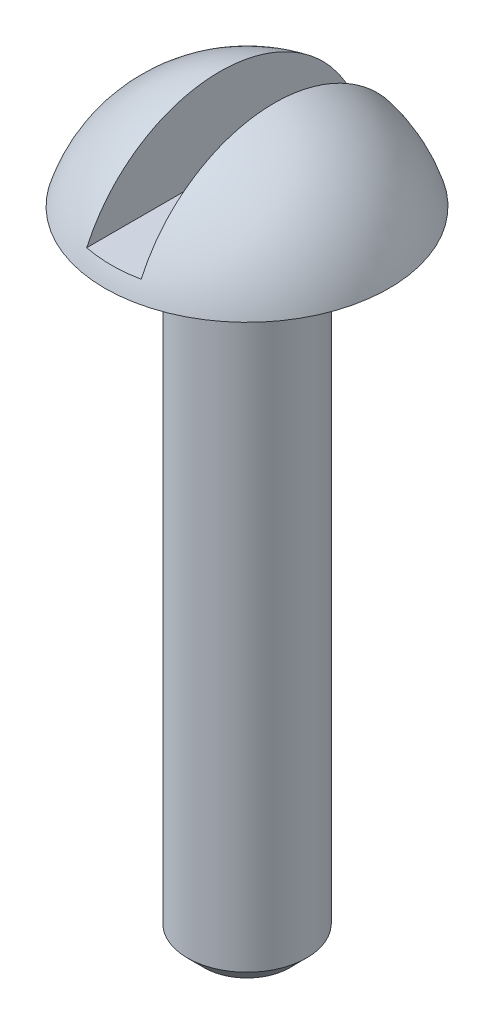
ISO-10303-21;
HEADER;
FILE_DESCRIPTION(('STEP AP214'),'2;1');
FILE_NAME('part.step','',(''),(''),'','','');
FILE_SCHEMA(('AUTOMOTIVE_DESIGN { 1 0 10303 214 1 1 1 1 }'));
ENDSEC;
DATA;
#1=APPLICATION_CONTEXT('core data for automotive mechanical design processes');
#2=APPLICATION_PROTOCOL_DEFINITION('international standard','automotive_design',2000,#1);
#3=PRODUCT_CONTEXT('',#1,'mechanical');
#4=PRODUCT('Part','Part','',(#3));
#5=PRODUCT_RELATED_PRODUCT_CATEGORY('part','',(#4));
#6=PRODUCT_DEFINITION_FORMATION('','',#4);
#7=PRODUCT_DEFINITION_CONTEXT('part definition',#1,'design');
#8=PRODUCT_DEFINITION('design','',#6,#7);
#9=PRODUCT_DEFINITION_SHAPE('','',#8);
#10=(LENGTH_UNIT() NAMED_UNIT(*) SI_UNIT(.MILLI.,.METRE.));
#11=(NAMED_UNIT(*) PLANE_ANGLE_UNIT() SI_UNIT($,.RADIAN.));
#12=(NAMED_UNIT(*) SI_UNIT($,.STERADIAN.) SOLID_ANGLE_UNIT());
#13=UNCERTAINTY_MEASURE_WITH_UNIT(LENGTH_MEASURE(1.E-05),#10,'distance_accuracy_value','');
#14=(GEOMETRIC_REPRESENTATION_CONTEXT(3) GLOBAL_UNCERTAINTY_ASSIGNED_CONTEXT((#13)) GLOBAL_UNIT_ASSIGNED_CONTEXT((#10,
#11,#12)) REPRESENTATION_CONTEXT('',''));
#15=CARTESIAN_POINT('',(0.,0.,0.));
#16=DIRECTION('',(0.,0.,1.));
#17=DIRECTION('',(1.,0.,0.));
#18=AXIS2_PLACEMENT_3D('',#15,#16,#17);
#19=CARTESIAN_POINT('',(0.,0.,0.));
#20=DIRECTION('',(0.,1.,0.));
#21=DIRECTION('',(0.,0.,1.));
#22=AXIS2_PLACEMENT_3D('',#19,#20,#21);
#23=PLANE('',#22);
#24=CARTESIAN_POINT('',(0.,0.,0.));
#25=DIRECTION('',(0.,1.,0.));
#26=DIRECTION('',(0.,0.,1.));
#27=AXIS2_PLACEMENT_3D('',#24,#25,#26);
#28=CIRCLE('',#27,2.1209);
#29=CARTESIAN_POINT('',(0.,0.,2.1209));
#30=VERTEX_POINT('',#29);
#31=EDGE_CURVE('E82',#30,#30,#28,.T.);
#32=ORIENTED_EDGE('',*,*,#31,.F.);
#33=EDGE_LOOP('',(#32));
#34=FACE_BOUND('',#33,.T.);
#35=CARTESIAN_POINT('',(0.,0.,0.));
#36=DIRECTION('',(0.,1.,0.));
#37=DIRECTION('',(0.,0.,1.));
#38=AXIS2_PLACEMENT_3D('',#35,#36,#37);
#39=CIRCLE('',#38,0.889);
#40=CARTESIAN_POINT('',(0.,0.,0.889));
#41=VERTEX_POINT('',#40);
#42=EDGE_CURVE('E79',#41,#41,#39,.F.);
#43=ORIENTED_EDGE('',*,*,#42,.F.);
#44=EDGE_LOOP('',(#43));
#45=FACE_BOUND('',#44,.T.);
#46=ADVANCED_FACE('F33',(#34,#45),#23,.F.);
#47=CARTESIAN_POINT('',(0.,-0.64078669354839,0.));
#48=DIRECTION('',(0.,1.,0.));
#49=DIRECTION('',(0.,0.,-1.));
#50=AXIS2_PLACEMENT_3D('',#47,#48,#49);
#51=SPHERICAL_SURFACE('',#50,2.21558669354839);
#52=CARTESIAN_POINT('',(0.4064,-0.64078669354839,0.));
#53=DIRECTION('',(-1.,0.,0.));
#54=DIRECTION('',(0.,0.,1.));
#55=AXIS2_PLACEMENT_3D('',#52,#53,#54);
#56=CIRCLE('',#55,2.1779952792944);
#57=CARTESIAN_POINT('',(0.4064,0.254,1.98570395821669));
#58=VERTEX_POINT('',#57);
#59=CARTESIAN_POINT('',(0.4064,0.254,-1.98570395821669));
#60=VERTEX_POINT('',#59);
#61=EDGE_CURVE('E37',#58,#60,#56,.T.);
#62=ORIENTED_EDGE('',*,*,#61,.F.);
#63=CARTESIAN_POINT('',(0.,0.254,0.));
#64=DIRECTION('',(0.,-1.,0.));
#65=DIRECTION('',(0.,0.,-1.));
#66=AXIS2_PLACEMENT_3D('',#63,#64,#65);
#67=CIRCLE('',#66,2.02686486221391);
#68=CARTESIAN_POINT('',(-0.4064,0.254,1.98570395821669));
#69=VERTEX_POINT('',#68);
#70=EDGE_CURVE('E11',#58,#69,#67,.T.);
#71=ORIENTED_EDGE('',*,*,#70,.T.);
#72=CARTESIAN_POINT('',(-0.4064,-0.64078669354839,0.));
#73=DIRECTION('',(1.,0.,0.));
#74=DIRECTION('',(0.,0.,-1.));
#75=AXIS2_PLACEMENT_3D('',#72,#73,#74);
#76=CIRCLE('',#75,2.1779952792944);
#77=CARTESIAN_POINT('',(-0.4064,0.254,-1.98570395821669));
#78=VERTEX_POINT('',#77);
#79=EDGE_CURVE('E57',#78,#69,#76,.T.);
#80=ORIENTED_EDGE('',*,*,#79,.F.);
#81=EDGE_CURVE('E43',#78,#60,#67,.T.);
#82=ORIENTED_EDGE('',*,*,#81,.T.);
#83=EDGE_LOOP('',(#62,#71,#80,#82));
#84=FACE_BOUND('',#83,.T.);
#85=ORIENTED_EDGE('',*,*,#31,.T.);
#86=EDGE_LOOP('',(#85));
#87=FACE_BOUND('',#86,.T.);
#88=ADVANCED_FACE('F70',(#84,#87),#51,.T.);
#89=CARTESIAN_POINT('',(0.,-9.525,0.));
#90=DIRECTION('',(0.,1.,0.));
#91=DIRECTION('',(0.,0.,1.));
#92=AXIS2_PLACEMENT_3D('',#89,#90,#91);
#93=CYLINDRICAL_SURFACE('',#92,0.889);
#94=CARTESIAN_POINT('',(0.,-9.271,0.));
#95=DIRECTION('',(0.,-1.,0.));
#96=DIRECTION('',(0.,0.,-1.));
#97=AXIS2_PLACEMENT_3D('',#94,#95,#96);
#98=CIRCLE('',#97,0.889);
#99=CARTESIAN_POINT('',(0.,-9.271,0.888999999999999));
#100=VERTEX_POINT('',#99);
#101=EDGE_CURVE('E72',#100,#100,#98,.F.);
#102=CARTESIAN_POINT('',(0.,-9.271,0.888999999999999));
#103=CARTESIAN_POINT('',(0.,-9.17442708333334,0.888999999999999));
#104=CARTESIAN_POINT('',(0.,-9.07785416666667,0.888999999999999));
#105=CARTESIAN_POINT('',(0.,-8.88470833333334,0.888999999999999));
#106=CARTESIAN_POINT('',(0.,-8.78813541666667,0.888999999999999));
#107=CARTESIAN_POINT('',(0.,-8.59498958333334,0.888999999999999));
#108=CARTESIAN_POINT('',(0.,-8.49841666666667,0.888999999999999));
#109=CARTESIAN_POINT('',(0.,-8.30527083333334,0.888999999999999));
#110=CARTESIAN_POINT('',(0.,-8.20869791666667,0.888999999999999));
#111=CARTESIAN_POINT('',(0.,-8.01555208333334,0.888999999999999));
#112=CARTESIAN_POINT('',(0.,-7.91897916666667,0.888999999999999));
#113=CARTESIAN_POINT('',(0.,-7.72583333333334,0.888999999999999));
#114=CARTESIAN_POINT('',(0.,-7.62926041666667,0.888999999999999));
#115=CARTESIAN_POINT('',(0.,-7.43611458333334,0.888999999999999));
#116=CARTESIAN_POINT('',(0.,-7.33954166666667,0.888999999999999));
#117=CARTESIAN_POINT('',(0.,-7.14639583333334,0.888999999999999));
#118=CARTESIAN_POINT('',(0.,-7.04982291666667,0.888999999999999));
#119=CARTESIAN_POINT('',(0.,-6.85667708333334,0.888999999999999));
#120=CARTESIAN_POINT('',(0.,-6.76010416666667,0.888999999999999));
#121=CARTESIAN_POINT('',(0.,-6.56695833333334,0.888999999999999));
#122=CARTESIAN_POINT('',(0.,-6.47038541666667,0.888999999999999));
#123=CARTESIAN_POINT('',(0.,-6.27723958333334,0.888999999999999));
#124=CARTESIAN_POINT('',(0.,-6.18066666666667,0.888999999999999));
#125=CARTESIAN_POINT('',(0.,-5.98752083333334,0.888999999999999));
#126=CARTESIAN_POINT('',(0.,-5.89094791666667,0.888999999999999));
#127=CARTESIAN_POINT('',(0.,-5.69780208333334,0.888999999999999));
#128=CARTESIAN_POINT('',(0.,-5.60122916666667,0.888999999999999));
#129=CARTESIAN_POINT('',(0.,-5.40808333333334,0.888999999999999));
#130=CARTESIAN_POINT('',(0.,-5.31151041666667,0.888999999999999));
#131=CARTESIAN_POINT('',(0.,-5.11836458333334,0.888999999999999));
#132=CARTESIAN_POINT('',(0.,-5.02179166666667,0.888999999999999));
#133=CARTESIAN_POINT('',(0.,-4.82864583333334,0.888999999999999));
#134=CARTESIAN_POINT('',(0.,-4.73207291666667,0.888999999999999));
#135=CARTESIAN_POINT('',(0.,-4.53892708333334,0.888999999999999));
#136=CARTESIAN_POINT('',(0.,-4.44235416666667,0.888999999999999));
#137=CARTESIAN_POINT('',(0.,-4.24920833333334,0.888999999999999));
#138=CARTESIAN_POINT('',(0.,-4.15263541666667,0.888999999999999));
#139=CARTESIAN_POINT('',(0.,-3.95948958333334,0.888999999999999));
#140=CARTESIAN_POINT('',(0.,-3.86291666666667,0.888999999999999));
#141=CARTESIAN_POINT('',(0.,-3.66977083333334,0.888999999999999));
#142=CARTESIAN_POINT('',(0.,-3.57319791666667,0.888999999999999));
#143=CARTESIAN_POINT('',(0.,-3.38005208333333,0.888999999999999));
#144=CARTESIAN_POINT('',(0.,-3.28347916666667,0.888999999999999));
#145=CARTESIAN_POINT('',(0.,-3.09033333333333,0.888999999999999));
#146=CARTESIAN_POINT('',(0.,-2.99376041666667,0.889));
#147=CARTESIAN_POINT('',(0.,-2.80061458333333,0.889));
#148=CARTESIAN_POINT('',(0.,-2.70404166666667,0.889));
#149=CARTESIAN_POINT('',(0.,-2.51089583333333,0.889));
#150=CARTESIAN_POINT('',(0.,-2.41432291666667,0.889));
#151=CARTESIAN_POINT('',(0.,-2.22117708333333,0.889));
#152=CARTESIAN_POINT('',(0.,-2.12460416666667,0.889));
#153=CARTESIAN_POINT('',(0.,-1.93145833333333,0.889));
#154=CARTESIAN_POINT('',(0.,-1.83488541666667,0.889));
#155=CARTESIAN_POINT('',(0.,-1.64173958333333,0.889));
#156=CARTESIAN_POINT('',(0.,-1.54516666666667,0.889));
#157=CARTESIAN_POINT('',(0.,-1.35202083333333,0.889));
#158=CARTESIAN_POINT('',(0.,-1.25544791666667,0.889));
#159=CARTESIAN_POINT('',(0.,-1.06230208333333,0.889));
#160=CARTESIAN_POINT('',(0.,-0.965729166666667,0.889));
#161=CARTESIAN_POINT('',(0.,-0.772583333333334,0.889));
#162=CARTESIAN_POINT('',(0.,-0.676010416666667,0.889));
#163=CARTESIAN_POINT('',(0.,-0.482864583333334,0.889));
#164=CARTESIAN_POINT('',(0.,-0.386291666666667,0.889));
#165=CARTESIAN_POINT('',(0.,-0.193145833333334,0.889));
#166=CARTESIAN_POINT('',(0.,-0.096572916666667,0.889));
#167=CARTESIAN_POINT('',(0.,0.,0.889));
#168=B_SPLINE_CURVE_WITH_KNOTS('',3,(#102,#103,#104,#105,#106,#107,#108,#109,#110,#111,#112,
#113,#114,#115,#116,#117,#118,#119,#120,#121,#122,#123,#124,#125,#126,#127,#128,#129,#130,#131,
#132,#133,#134,#135,#136,#137,#138,#139,#140,#141,#142,#143,#144,#145,#146,#147,#148,#149,#150,
#151,#152,#153,#154,#155,#156,#157,#158,#159,#160,#161,#162,#163,#164,#165,#166,#167),
.UNSPECIFIED.,.F.,.F.,(4,2,2,2,2,2,2,2,2,2,2,2,2,2,2,2,2,2,2,2,2,2,2,2,2,2,2,2,2,2,2,2,4),(0.,
0.289718749999999,0.5794375,0.869156249999999,1.158875,1.44859375,1.7383125,2.02803125,2.31775,
2.60746875,2.8971875,3.18690625,3.476625,3.76634375,4.0560625,4.34578125,4.6355,4.92521875,
5.2149375,5.50465625,5.794375,6.08409375,6.3738125,6.66353125,6.95325,7.24296875,7.5326875,
7.82240625,8.112125,8.40184375,8.6915625,8.98128125,9.271),.UNSPECIFIED.);
#169=EDGE_CURVE('BSEAM91',#100,#41,#168,.T.);
#170=ORIENTED_EDGE('',*,*,#101,.T.);
#171=ORIENTED_EDGE('',*,*,#42,.T.);
#172=ORIENTED_EDGE('',*,*,#169,.T.);
#173=ORIENTED_EDGE('',*,*,#169,.F.);
#174=EDGE_LOOP('',(#170,#172,#171,#173));
#175=FACE_BOUND('',#174,.T.);
#176=ADVANCED_FACE('F91',(#175),#93,.T.);
#177=CARTESIAN_POINT('',(0.,-9.525,0.));
#178=DIRECTION('',(0.,-1.,0.));
#179=DIRECTION('',(0.,0.,-1.));
#180=AXIS2_PLACEMENT_3D('',#177,#178,#179);
#181=PLANE('',#180);
#182=CARTESIAN_POINT('',(0.,-9.525,0.));
#183=DIRECTION('',(0.,-1.,0.));
#184=DIRECTION('',(0.,0.,-1.));
#185=AXIS2_PLACEMENT_3D('',#182,#183,#184);
#186=CIRCLE('',#185,0.635000000000003);
#187=CARTESIAN_POINT('',(0.,-9.525,-0.635000000000005));
#188=VERTEX_POINT('',#187);
#189=EDGE_CURVE('E76',#188,#188,#186,.T.);
#190=ORIENTED_EDGE('',*,*,#189,.T.);
#191=EDGE_LOOP('',(#190));
#192=FACE_BOUND('',#191,.T.);
#193=ADVANCED_FACE('F93',(#192),#181,.T.);
#194=CARTESIAN_POINT('',(0.,-9.525,0.));
#195=DIRECTION('',(0.,1.,0.));
#196=DIRECTION('',(0.,0.,1.));
#197=AXIS2_PLACEMENT_3D('',#194,#195,#196);
#198=CONICAL_SURFACE('',#197,0.635000000000003,0.785398163397447);
#199=ORIENTED_EDGE('',*,*,#101,.F.);
#200=EDGE_LOOP('',(#199));
#201=FACE_BOUND('',#200,.T.);
#202=ORIENTED_EDGE('',*,*,#189,.F.);
#203=EDGE_LOOP('',(#202));
#204=FACE_BOUND('',#203,.T.);
#205=ADVANCED_FACE('F35',(#201,#204),#198,.T.);
#206=CARTESIAN_POINT('',(0.4064,1.5748,2.1209));
#207=DIRECTION('',(-1.,0.,0.));
#208=DIRECTION('',(0.,0.,1.));
#209=AXIS2_PLACEMENT_3D('',#206,#207,#208);
#210=PLANE('',#209);
#211=ORIENTED_EDGE('',*,*,#61,.T.);
#212=DIRECTION('',(0.,0.,-1.));
#213=VECTOR('',#212,1.);
#214=CARTESIAN_POINT('',(0.4064,0.254,2.1209));
#215=LINE('',#214,#213);
#216=EDGE_CURVE('E50',#58,#60,#215,.T.);
#217=ORIENTED_EDGE('',*,*,#216,.F.);
#218=EDGE_LOOP('',(#211,#217));
#219=FACE_BOUND('',#218,.T.);
#220=ADVANCED_FACE('F67',(#219),#210,.T.);
#221=CARTESIAN_POINT('',(-0.4064,1.5748,2.1209));
#222=DIRECTION('',(1.,0.,0.));
#223=DIRECTION('',(0.,0.,-1.));
#224=AXIS2_PLACEMENT_3D('',#221,#222,#223);
#225=PLANE('',#224);
#226=ORIENTED_EDGE('',*,*,#79,.T.);
#227=DIRECTION('',(0.,0.,1.));
#228=VECTOR('',#227,1.);
#229=CARTESIAN_POINT('',(-0.4064,0.254,2.1209));
#230=LINE('',#229,#228);
#231=EDGE_CURVE('E63',#78,#69,#230,.T.);
#232=ORIENTED_EDGE('',*,*,#231,.F.);
#233=EDGE_LOOP('',(#226,#232));
#234=FACE_BOUND('',#233,.T.);
#235=ADVANCED_FACE('F106',(#234),#225,.T.);
#236=CARTESIAN_POINT('',(0.,0.254,0.));
#237=DIRECTION('',(0.,-1.,0.));
#238=DIRECTION('',(0.,0.,-1.));
#239=AXIS2_PLACEMENT_3D('',#236,#237,#238);
#240=PLANE('',#239);
#241=ORIENTED_EDGE('',*,*,#216,.T.);
#242=ORIENTED_EDGE('',*,*,#81,.F.);
#243=ORIENTED_EDGE('',*,*,#231,.T.);
#244=ORIENTED_EDGE('',*,*,#70,.F.);
#245=EDGE_LOOP('',(#241,#242,#243,#244));
#246=FACE_BOUND('',#245,.T.);
#247=ADVANCED_FACE('F62',(#246),#240,.F.);
#248=CLOSED_SHELL('',(#46,#88,#176,#193,#205,#220,#235,#247));
#249=MANIFOLD_SOLID_BREP('B2',#248);
#250=ADVANCED_BREP_SHAPE_REPRESENTATION('',(#18,#249),#14);
#251=SHAPE_DEFINITION_REPRESENTATION(#9,#250);
ENDSEC;
END-ISO-10303-21;
